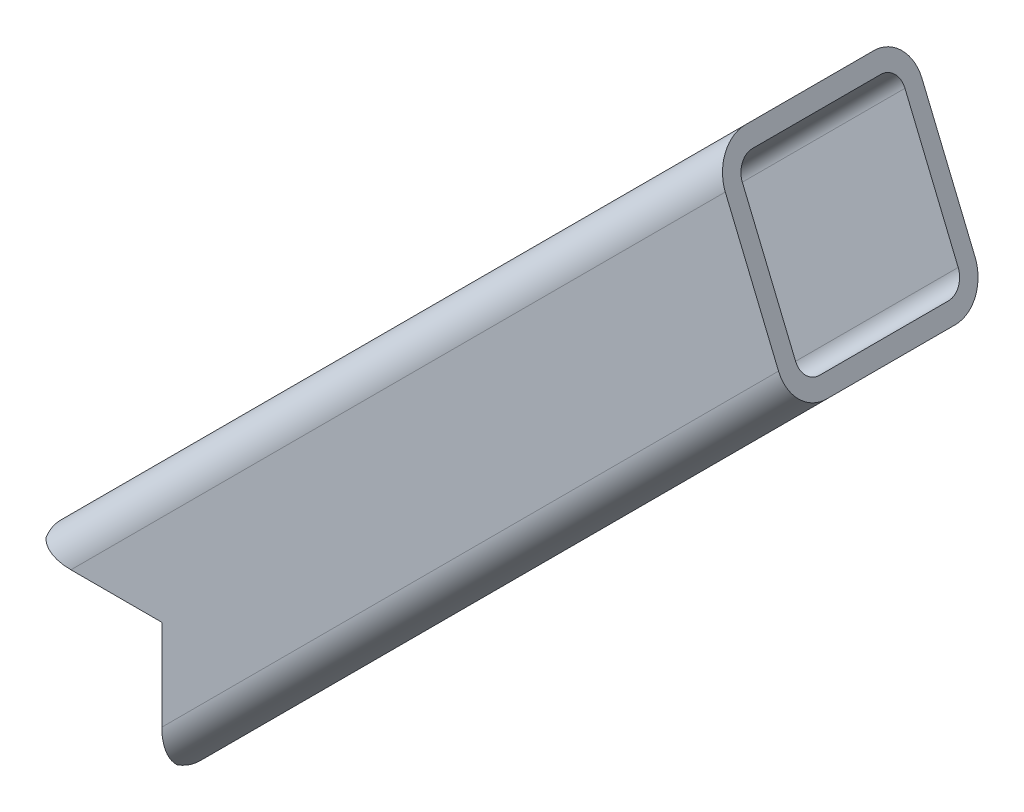
ISO-10303-21;
HEADER;
FILE_DESCRIPTION(('STEP AP214'),'2;1');
FILE_NAME('part.step','',(''),(''),'','','');
FILE_SCHEMA(('AUTOMOTIVE_DESIGN { 1 0 10303 214 1 1 1 1 }'));
ENDSEC;
DATA;
#1=APPLICATION_CONTEXT('core data for automotive mechanical design processes');
#2=APPLICATION_PROTOCOL_DEFINITION('international standard','automotive_design',2000,#1);
#3=PRODUCT_CONTEXT('',#1,'mechanical');
#4=PRODUCT('Part','Part','',(#3));
#5=PRODUCT_RELATED_PRODUCT_CATEGORY('part','',(#4));
#6=PRODUCT_DEFINITION_FORMATION('','',#4);
#7=PRODUCT_DEFINITION_CONTEXT('part definition',#1,'design');
#8=PRODUCT_DEFINITION('design','',#6,#7);
#9=PRODUCT_DEFINITION_SHAPE('','',#8);
#10=(LENGTH_UNIT() NAMED_UNIT(*) SI_UNIT(.MILLI.,.METRE.));
#11=(NAMED_UNIT(*) PLANE_ANGLE_UNIT() SI_UNIT($,.RADIAN.));
#12=(NAMED_UNIT(*) SI_UNIT($,.STERADIAN.) SOLID_ANGLE_UNIT());
#13=UNCERTAINTY_MEASURE_WITH_UNIT(LENGTH_MEASURE(1.E-05),#10,'distance_accuracy_value','');
#14=(GEOMETRIC_REPRESENTATION_CONTEXT(3) GLOBAL_UNCERTAINTY_ASSIGNED_CONTEXT((#13)) GLOBAL_UNIT_ASSIGNED_CONTEXT((#10,
#11,#12)) REPRESENTATION_CONTEXT('',''));
#15=CARTESIAN_POINT('',(0.,0.,0.));
#16=DIRECTION('',(0.,0.,1.));
#17=DIRECTION('',(1.,0.,0.));
#18=AXIS2_PLACEMENT_3D('',#15,#16,#17);
#19=CARTESIAN_POINT('',(-231.929646455628,206.929646455628,1415.2));
#20=DIRECTION('',(0.707106781186551,0.707106781186544,0.));
#21=DIRECTION('',(0.,0.,-1.));
#22=AXIS2_PLACEMENT_3D('',#19,#20,#21);
#23=PLANE('',#22);
#24=CARTESIAN_POINT('',(-218.070353544372,193.070353544372,1434.8));
#25=DIRECTION('',(0.707106781186551,0.707106781186544,0.));
#26=DIRECTION('',(0.,0.,-1.));
#27=AXIS2_PLACEMENT_3D('',#24,#25,#26);
#28=CIRCLE('',#27,5.19999999999995);
#29=CARTESIAN_POINT('',(-215.,190.,1437.66109388611));
#30=VERTEX_POINT('',#29);
#31=CARTESIAN_POINT('',(-214.393398282202,189.393398282202,1434.8));
#32=VERTEX_POINT('',#31);
#33=EDGE_CURVE('E140',#30,#32,#28,.T.);
#34=ORIENTED_EDGE('',*,*,#33,.F.);
#35=DIRECTION('',(0.,0.,1.));
#36=VECTOR('',#35,1.);
#37=CARTESIAN_POINT('',(-215.,190.,1300.));
#38=LINE('',#37,#36);
#39=CARTESIAN_POINT('',(-215.,190.,1412.33890611389));
#40=VERTEX_POINT('',#39);
#41=EDGE_CURVE('E136',#40,#30,#38,.T.);
#42=ORIENTED_EDGE('',*,*,#41,.F.);
#43=CARTESIAN_POINT('',(-218.070353544372,193.070353544372,1415.2));
#44=DIRECTION('',(0.707106781186551,0.707106781186544,0.));
#45=DIRECTION('',(0.,0.,-1.));
#46=AXIS2_PLACEMENT_3D('',#43,#44,#45);
#47=CIRCLE('',#46,5.19999999999995);
#48=CARTESIAN_POINT('',(-214.393398282202,189.393398282202,1415.2));
#49=VERTEX_POINT('',#48);
#50=EDGE_CURVE('E133',#49,#40,#47,.T.);
#51=ORIENTED_EDGE('',*,*,#50,.F.);
#52=DIRECTION('',(0.,0.,-1.));
#53=VECTOR('',#52,1.);
#54=CARTESIAN_POINT('',(-214.393398282202,189.393398282202,1434.8));
#55=LINE('',#54,#53);
#56=EDGE_CURVE('E127',#32,#49,#55,.T.);
#57=ORIENTED_EDGE('',*,*,#56,.F.);
#58=EDGE_LOOP('',(#34,#42,#51,#57));
#59=FACE_BOUND('',#58,.T.);
#60=ADVANCED_FACE('F39',(#59),#23,.F.);
#61=CARTESIAN_POINT('',(-124.999999999999,300.,1425.));
#62=DIRECTION('',(0.923879532511288,0.382683432365088,0.));
#63=DIRECTION('',(-0.382683432365088,0.923879532511288,0.));
#64=AXIS2_PLACEMENT_3D('',#61,#62,#63);
#65=PLANE('',#64);
#66=CARTESIAN_POINT('',(-129.059292911255,309.8,1434.8));
#67=DIRECTION('',(0.923879532511288,0.382683432365088,0.));
#68=DIRECTION('',(0.382683432365088,-0.923879532511288,0.));
#69=AXIS2_PLACEMENT_3D('',#66,#67,#68);
#70=ELLIPSE('',#69,2.81421972076021,2.59999999999999);
#71=CARTESIAN_POINT('',(-130.136248173425,312.4,1434.8));
#72=VERTEX_POINT('',#71);
#73=CARTESIAN_POINT('',(-129.059292911255,309.8,1437.4));
#74=VERTEX_POINT('',#73);
#75=EDGE_CURVE('E208',#72,#74,#70,.T.);
#76=ORIENTED_EDGE('',*,*,#75,.F.);
#77=DIRECTION('',(0.,0.,1.));
#78=VECTOR('',#77,1.);
#79=CARTESIAN_POINT('',(-130.136248173425,312.4,1415.2));
#80=LINE('',#79,#78);
#81=CARTESIAN_POINT('',(-130.136248173425,312.4,1415.2));
#82=VERTEX_POINT('',#81);
#83=EDGE_CURVE('E204',#82,#72,#80,.T.);
#84=ORIENTED_EDGE('',*,*,#83,.F.);
#85=CARTESIAN_POINT('',(-129.059292911255,309.8,1415.2));
#86=DIRECTION('',(0.923879532511288,0.382683432365088,0.));
#87=DIRECTION('',(0.382683432365088,-0.923879532511288,0.));
#88=AXIS2_PLACEMENT_3D('',#85,#86,#87);
#89=ELLIPSE('',#88,2.81421972076021,2.59999999999999);
#90=CARTESIAN_POINT('',(-129.059292911255,309.8,1412.6));
#91=VERTEX_POINT('',#90);
#92=EDGE_CURVE('E200',#91,#82,#89,.T.);
#93=ORIENTED_EDGE('',*,*,#92,.F.);
#94=DIRECTION('',(-0.382683432365088,0.923879532511288,0.));
#95=VECTOR('',#94,1.);
#96=CARTESIAN_POINT('',(-128.464823227813,308.364823227814,1412.6));
#97=LINE('',#96,#95);
#98=CARTESIAN_POINT('',(-120.940707088743,290.2,1412.6));
#99=VERTEX_POINT('',#98);
#100=EDGE_CURVE('E196',#99,#91,#97,.T.);
#101=ORIENTED_EDGE('',*,*,#100,.F.);
#102=CARTESIAN_POINT('',(-120.940707088743,290.2,1415.2));
#103=DIRECTION('',(0.923879532511288,0.382683432365088,0.));
#104=DIRECTION('',(0.382683432365088,-0.923879532511288,0.));
#105=AXIS2_PLACEMENT_3D('',#102,#103,#104);
#106=ELLIPSE('',#105,2.81421972076021,2.59999999999999);
#107=CARTESIAN_POINT('',(-119.863751826573,287.6,1415.2));
#108=VERTEX_POINT('',#107);
#109=EDGE_CURVE('E192',#108,#99,#106,.T.);
#110=ORIENTED_EDGE('',*,*,#109,.F.);
#111=DIRECTION('',(0.,0.,-1.));
#112=VECTOR('',#111,1.);
#113=CARTESIAN_POINT('',(-119.863751826573,287.6,1434.8));
#114=LINE('',#113,#112);
#115=CARTESIAN_POINT('',(-119.863751826573,287.6,1434.8));
#116=VERTEX_POINT('',#115);
#117=EDGE_CURVE('E187',#116,#108,#114,.T.);
#118=ORIENTED_EDGE('',*,*,#117,.F.);
#119=CARTESIAN_POINT('',(-120.940707088743,290.2,1434.8));
#120=DIRECTION('',(0.923879532511288,0.382683432365088,0.));
#121=DIRECTION('',(0.382683432365088,-0.923879532511288,0.));
#122=AXIS2_PLACEMENT_3D('',#119,#120,#121);
#123=ELLIPSE('',#122,2.81421972076021,2.59999999999999);
#124=CARTESIAN_POINT('',(-120.940707088743,290.2,1437.4));
#125=VERTEX_POINT('',#124);
#126=EDGE_CURVE('E182',#125,#116,#123,.T.);
#127=ORIENTED_EDGE('',*,*,#126,.F.);
#128=DIRECTION('',(0.382683432365088,-0.923879532511288,0.));
#129=VECTOR('',#128,1.);
#130=CARTESIAN_POINT('',(-121.535176772185,291.635176772186,1437.4));
#131=LINE('',#130,#129);
#132=EDGE_CURVE('E177',#74,#125,#131,.T.);
#133=ORIENTED_EDGE('',*,*,#132,.F.);
#134=EDGE_LOOP('',(#76,#84,#93,#101,#110,#118,#127,#133));
#135=FACE_BOUND('',#134,.T.);
#136=DIRECTION('',(-0.382683432365088,0.923879532511288,0.));
#137=VECTOR('',#136,1.);
#138=CARTESIAN_POINT('',(-128.464823227813,308.364823227814,1410.));
#139=LINE('',#138,#137);
#140=CARTESIAN_POINT('',(-120.940707088743,290.2,1410.));
#141=VERTEX_POINT('',#140);
#142=CARTESIAN_POINT('',(-129.059292911255,309.8,1410.));
#143=VERTEX_POINT('',#142);
#144=EDGE_CURVE('E289',#141,#143,#139,.T.);
#145=ORIENTED_EDGE('',*,*,#144,.T.);
#146=CARTESIAN_POINT('',(-129.059292911255,309.8,1415.2));
#147=DIRECTION('',(0.923879532511288,0.382683432365088,0.));
#148=DIRECTION('',(0.382683432365088,-0.923879532511288,0.));
#149=AXIS2_PLACEMENT_3D('',#146,#147,#148);
#150=ELLIPSE('',#149,5.62843944152039,5.19999999999995);
#151=CARTESIAN_POINT('',(-131.213203435595,315.,1415.2));
#152=VERTEX_POINT('',#151);
#153=EDGE_CURVE('E286',#143,#152,#150,.T.);
#154=ORIENTED_EDGE('',*,*,#153,.T.);
#155=DIRECTION('',(0.,0.,1.));
#156=VECTOR('',#155,1.);
#157=CARTESIAN_POINT('',(-131.213203435595,315.,1415.2));
#158=LINE('',#157,#156);
#159=CARTESIAN_POINT('',(-131.213203435595,315.,1434.8));
#160=VERTEX_POINT('',#159);
#161=EDGE_CURVE('E283',#152,#160,#158,.T.);
#162=ORIENTED_EDGE('',*,*,#161,.T.);
#163=CARTESIAN_POINT('',(-129.059292911255,309.8,1434.8));
#164=DIRECTION('',(0.923879532511288,0.382683432365088,0.));
#165=DIRECTION('',(0.382683432365088,-0.923879532511288,0.));
#166=AXIS2_PLACEMENT_3D('',#163,#164,#165);
#167=ELLIPSE('',#166,5.62843944152039,5.19999999999995);
#168=CARTESIAN_POINT('',(-129.059292911255,309.8,1440.));
#169=VERTEX_POINT('',#168);
#170=EDGE_CURVE('E280',#160,#169,#167,.T.);
#171=ORIENTED_EDGE('',*,*,#170,.T.);
#172=DIRECTION('',(0.382683432365088,-0.923879532511288,0.));
#173=VECTOR('',#172,1.);
#174=CARTESIAN_POINT('',(-121.535176772185,291.635176772186,1440.));
#175=LINE('',#174,#173);
#176=CARTESIAN_POINT('',(-120.940707088743,290.2,1440.));
#177=VERTEX_POINT('',#176);
#178=EDGE_CURVE('E277',#169,#177,#175,.T.);
#179=ORIENTED_EDGE('',*,*,#178,.T.);
#180=CARTESIAN_POINT('',(-120.940707088743,290.2,1434.8));
#181=DIRECTION('',(0.923879532511288,0.382683432365088,0.));
#182=DIRECTION('',(0.382683432365088,-0.923879532511288,0.));
#183=AXIS2_PLACEMENT_3D('',#180,#181,#182);
#184=ELLIPSE('',#183,5.62843944152039,5.19999999999995);
#185=CARTESIAN_POINT('',(-118.786796564403,285.,1434.8));
#186=VERTEX_POINT('',#185);
#187=EDGE_CURVE('E274',#177,#186,#184,.T.);
#188=ORIENTED_EDGE('',*,*,#187,.T.);
#189=DIRECTION('',(0.,0.,-1.));
#190=VECTOR('',#189,1.);
#191=CARTESIAN_POINT('',(-118.786796564403,285.,1434.8));
#192=LINE('',#191,#190);
#193=CARTESIAN_POINT('',(-118.786796564403,285.,1415.2));
#194=VERTEX_POINT('',#193);
#195=EDGE_CURVE('E272',#186,#194,#192,.T.);
#196=ORIENTED_EDGE('',*,*,#195,.T.);
#197=CARTESIAN_POINT('',(-120.940707088743,290.2,1415.2));
#198=DIRECTION('',(0.923879532511288,0.382683432365088,0.));
#199=DIRECTION('',(0.382683432365088,-0.923879532511288,0.));
#200=AXIS2_PLACEMENT_3D('',#197,#198,#199);
#201=ELLIPSE('',#200,5.62843944152039,5.19999999999995);
#202=EDGE_CURVE('E148',#194,#141,#201,.T.);
#203=ORIENTED_EDGE('',*,*,#202,.T.);
#204=EDGE_LOOP('',(#145,#154,#162,#171,#179,#188,#196,#203));
#205=FACE_BOUND('',#204,.T.);
#206=ADVANCED_FACE('F331',(#135,#205),#65,.T.);
#207=CARTESIAN_POINT('',(-118.070353544371,293.070353544372,1415.2));
#208=DIRECTION('',(-0.707106781186551,-0.707106781186544,0.));
#209=DIRECTION('',(0.707106781186544,-0.707106781186551,0.));
#210=AXIS2_PLACEMENT_3D('',#207,#208,#209);
#211=CYLINDRICAL_SURFACE('',#210,2.59999999999999);
#212=DIRECTION('',(-0.707106781186551,-0.707106781186544,0.));
#213=VECTOR('',#212,1.);
#214=CARTESIAN_POINT('',(-116.231875913286,291.231875913287,1415.2));
#215=LINE('',#214,#213);
#216=CARTESIAN_POINT('',(-215.,192.463751826574,1415.2));
#217=VERTEX_POINT('',#216);
#218=EDGE_CURVE('E183',#108,#217,#215,.T.);
#219=ORIENTED_EDGE('',*,*,#218,.F.);
#220=ORIENTED_EDGE('',*,*,#109,.T.);
#221=DIRECTION('',(-0.707106781186551,-0.707106781186544,0.));
#222=VECTOR('',#221,1.);
#223=CARTESIAN_POINT('',(-118.070353544371,293.070353544372,1412.6));
#224=LINE('',#223,#222);
#225=CARTESIAN_POINT('',(-215.,196.140707088744,1412.6));
#226=VERTEX_POINT('',#225);
#227=EDGE_CURVE('E188',#99,#226,#224,.T.);
#228=ORIENTED_EDGE('',*,*,#227,.T.);
#229=CARTESIAN_POINT('',(-215.,196.140707088744,1415.2));
#230=DIRECTION('',(-1.,0.,0.));
#231=DIRECTION('',(0.,-1.,0.));
#232=AXIS2_PLACEMENT_3D('',#229,#230,#231);
#233=ELLIPSE('',#232,3.67695526217002,2.59999999999999);
#234=EDGE_CURVE('E191',#226,#217,#233,.T.);
#235=ORIENTED_EDGE('',*,*,#234,.T.);
#236=EDGE_LOOP('',(#219,#220,#228,#235));
#237=FACE_BOUND('',#236,.T.);
#238=ADVANCED_FACE('F360',(#237),#211,.F.);
#239=CARTESIAN_POINT('',(-116.231875913286,291.231875913287,1434.8));
#240=DIRECTION('',(-0.707106781186544,0.707106781186551,0.));
#241=DIRECTION('',(-0.707106781186551,-0.707106781186544,0.));
#242=AXIS2_PLACEMENT_3D('',#239,#240,#241);
#243=PLANE('',#242);
#244=DIRECTION('',(-0.707106781186551,-0.707106781186544,0.));
#245=VECTOR('',#244,1.);
#246=CARTESIAN_POINT('',(-116.231875913286,291.231875913287,1434.8));
#247=LINE('',#246,#245);
#248=CARTESIAN_POINT('',(-215.,192.463751826574,1434.8));
#249=VERTEX_POINT('',#248);
#250=EDGE_CURVE('E178',#116,#249,#247,.T.);
#251=ORIENTED_EDGE('',*,*,#250,.F.);
#252=ORIENTED_EDGE('',*,*,#117,.T.);
#253=ORIENTED_EDGE('',*,*,#218,.T.);
#254=DIRECTION('',(0.,0.,1.));
#255=VECTOR('',#254,1.);
#256=CARTESIAN_POINT('',(-215.,192.463751826574,1434.8));
#257=LINE('',#256,#255);
#258=EDGE_CURVE('E186',#217,#249,#257,.T.);
#259=ORIENTED_EDGE('',*,*,#258,.T.);
#260=EDGE_LOOP('',(#251,#252,#253,#259));
#261=FACE_BOUND('',#260,.T.);
#262=ADVANCED_FACE('F373',(#261),#243,.T.);
#263=CARTESIAN_POINT('',(-118.070353544371,293.070353544372,1434.8));
#264=DIRECTION('',(-0.707106781186551,-0.707106781186544,0.));
#265=DIRECTION('',(0.707106781186544,-0.707106781186551,0.));
#266=AXIS2_PLACEMENT_3D('',#263,#264,#265);
#267=CYLINDRICAL_SURFACE('',#266,2.59999999999999);
#268=DIRECTION('',(-0.707106781186551,-0.707106781186544,0.));
#269=VECTOR('',#268,1.);
#270=CARTESIAN_POINT('',(-118.070353544371,293.070353544372,1437.4));
#271=LINE('',#270,#269);
#272=CARTESIAN_POINT('',(-215.,196.140707088744,1437.4));
#273=VERTEX_POINT('',#272);
#274=EDGE_CURVE('E173',#125,#273,#271,.T.);
#275=ORIENTED_EDGE('',*,*,#274,.F.);
#276=ORIENTED_EDGE('',*,*,#126,.T.);
#277=ORIENTED_EDGE('',*,*,#250,.T.);
#278=CARTESIAN_POINT('',(-215.,196.140707088744,1434.8));
#279=DIRECTION('',(-1.,0.,0.));
#280=DIRECTION('',(0.,-1.,0.));
#281=AXIS2_PLACEMENT_3D('',#278,#279,#280);
#282=ELLIPSE('',#281,3.67695526217002,2.59999999999999);
#283=EDGE_CURVE('E181',#249,#273,#282,.T.);
#284=ORIENTED_EDGE('',*,*,#283,.T.);
#285=EDGE_LOOP('',(#275,#276,#277,#284));
#286=FACE_BOUND('',#285,.T.);
#287=ADVANCED_FACE('F376',(#286),#267,.F.);
#288=CARTESIAN_POINT('',(-118.070353544371,293.070353544372,1440.));
#289=DIRECTION('',(0.,0.,-1.));
#290=DIRECTION('',(-1.,0.,0.));
#291=AXIS2_PLACEMENT_3D('',#288,#289,#290);
#292=PLANE('',#291);
#293=ORIENTED_EDGE('',*,*,#178,.F.);
#294=DIRECTION('',(-0.707106781186551,-0.707106781186544,0.));
#295=VECTOR('',#294,1.);
#296=CARTESIAN_POINT('',(-131.929646455627,306.929646455628,1440.));
#297=LINE('',#296,#295);
#298=CARTESIAN_POINT('',(-228.859292911256,210.,1440.));
#299=VERTEX_POINT('',#298);
#300=EDGE_CURVE('E209',#169,#299,#297,.T.);
#301=ORIENTED_EDGE('',*,*,#300,.T.);
#302=DIRECTION('',(-1.,0.,0.));
#303=VECTOR('',#302,1.);
#304=CARTESIAN_POINT('',(-118.070353544371,210.,1440.));
#305=LINE('',#304,#303);
#306=CARTESIAN_POINT('',(-215.,210.,1440.));
#307=VERTEX_POINT('',#306);
#308=EDGE_CURVE('E238',#307,#299,#305,.T.);
#309=ORIENTED_EDGE('',*,*,#308,.F.);
#310=DIRECTION('',(0.,1.,0.));
#311=VECTOR('',#310,1.);
#312=CARTESIAN_POINT('',(-215.,293.070353544372,1440.));
#313=LINE('',#312,#311);
#314=CARTESIAN_POINT('',(-215.,196.140707088744,1440.));
#315=VERTEX_POINT('',#314);
#316=EDGE_CURVE('E236',#315,#307,#313,.T.);
#317=ORIENTED_EDGE('',*,*,#316,.F.);
#318=DIRECTION('',(-0.707106781186551,-0.707106781186544,0.));
#319=VECTOR('',#318,1.);
#320=CARTESIAN_POINT('',(-118.070353544371,293.070353544372,1440.));
#321=LINE('',#320,#319);
#322=EDGE_CURVE('E214',#177,#315,#321,.T.);
#323=ORIENTED_EDGE('',*,*,#322,.F.);
#324=EDGE_LOOP('',(#293,#301,#309,#317,#323));
#325=FACE_BOUND('',#324,.T.);
#326=ADVANCED_FACE('F381',(#325),#292,.F.);
#327=CARTESIAN_POINT('',(-118.070353544371,293.070353544372,1437.4));
#328=DIRECTION('',(0.,0.,-1.));
#329=DIRECTION('',(-1.,0.,0.));
#330=AXIS2_PLACEMENT_3D('',#327,#328,#329);
#331=PLANE('',#330);
#332=DIRECTION('',(-0.707106781186551,-0.707106781186544,0.));
#333=VECTOR('',#332,1.);
#334=CARTESIAN_POINT('',(-131.929646455627,306.929646455628,1437.4));
#335=LINE('',#334,#333);
#336=CARTESIAN_POINT('',(-228.859292911256,210.,1437.4));
#337=VERTEX_POINT('',#336);
#338=EDGE_CURVE('E205',#74,#337,#335,.T.);
#339=ORIENTED_EDGE('',*,*,#338,.F.);
#340=ORIENTED_EDGE('',*,*,#132,.T.);
#341=ORIENTED_EDGE('',*,*,#274,.T.);
#342=DIRECTION('',(0.,1.,0.));
#343=VECTOR('',#342,1.);
#344=CARTESIAN_POINT('',(-215.,293.070353544372,1437.4));
#345=LINE('',#344,#343);
#346=CARTESIAN_POINT('',(-215.,210.,1437.4));
#347=VERTEX_POINT('',#346);
#348=EDGE_CURVE('E176',#273,#347,#345,.T.);
#349=ORIENTED_EDGE('',*,*,#348,.T.);
#350=DIRECTION('',(-1.,0.,0.));
#351=VECTOR('',#350,1.);
#352=CARTESIAN_POINT('',(-118.070353544371,210.,1437.4));
#353=LINE('',#352,#351);
#354=EDGE_CURVE('E250',#347,#337,#353,.T.);
#355=ORIENTED_EDGE('',*,*,#354,.T.);
#356=EDGE_LOOP('',(#339,#340,#341,#349,#355));
#357=FACE_BOUND('',#356,.T.);
#358=ADVANCED_FACE('F318',(#357),#331,.T.);
#359=CARTESIAN_POINT('',(-131.929646455627,306.929646455628,1434.8));
#360=DIRECTION('',(-0.707106781186551,-0.707106781186544,0.));
#361=DIRECTION('',(0.707106781186544,-0.707106781186551,0.));
#362=AXIS2_PLACEMENT_3D('',#359,#360,#361);
#363=CYLINDRICAL_SURFACE('',#362,2.59999999999999);
#364=DIRECTION('',(-0.707106781186551,-0.707106781186544,0.));
#365=VECTOR('',#364,1.);
#366=CARTESIAN_POINT('',(-133.768124086712,308.768124086713,1434.8));
#367=LINE('',#366,#365);
#368=CARTESIAN_POINT('',(-232.536248173426,210.,1434.8));
#369=VERTEX_POINT('',#368);
#370=EDGE_CURVE('E201',#72,#369,#367,.T.);
#371=ORIENTED_EDGE('',*,*,#370,.F.);
#372=ORIENTED_EDGE('',*,*,#75,.T.);
#373=ORIENTED_EDGE('',*,*,#338,.T.);
#374=CARTESIAN_POINT('',(-228.859292911256,210.,1434.8));
#375=DIRECTION('',(0.,-1.,0.));
#376=DIRECTION('',(-1.,0.,0.));
#377=AXIS2_PLACEMENT_3D('',#374,#375,#376);
#378=ELLIPSE('',#377,3.67695526217005,2.59999999999999);
#379=EDGE_CURVE('E207',#337,#369,#378,.T.);
#380=ORIENTED_EDGE('',*,*,#379,.T.);
#381=EDGE_LOOP('',(#371,#372,#373,#380));
#382=FACE_BOUND('',#381,.T.);
#383=ADVANCED_FACE('F310',(#382),#363,.F.);
#384=CARTESIAN_POINT('',(-133.768124086712,308.768124086713,1415.2));
#385=DIRECTION('',(0.707106781186544,-0.707106781186551,0.));
#386=DIRECTION('',(0.707106781186551,0.707106781186544,0.));
#387=AXIS2_PLACEMENT_3D('',#384,#385,#386);
#388=PLANE('',#387);
#389=DIRECTION('',(-0.707106781186551,-0.707106781186544,0.));
#390=VECTOR('',#389,1.);
#391=CARTESIAN_POINT('',(-133.768124086712,308.768124086713,1415.2));
#392=LINE('',#391,#390);
#393=CARTESIAN_POINT('',(-232.536248173426,210.,1415.2));
#394=VERTEX_POINT('',#393);
#395=EDGE_CURVE('E197',#82,#394,#392,.T.);
#396=ORIENTED_EDGE('',*,*,#395,.F.);
#397=ORIENTED_EDGE('',*,*,#83,.T.);
#398=ORIENTED_EDGE('',*,*,#370,.T.);
#399=DIRECTION('',(0.,0.,-1.));
#400=VECTOR('',#399,1.);
#401=CARTESIAN_POINT('',(-232.536248173426,210.,1415.2));
#402=LINE('',#401,#400);
#403=EDGE_CURVE('E203',#369,#394,#402,.T.);
#404=ORIENTED_EDGE('',*,*,#403,.T.);
#405=EDGE_LOOP('',(#396,#397,#398,#404));
#406=FACE_BOUND('',#405,.T.);
#407=ADVANCED_FACE('F329',(#406),#388,.T.);
#408=CARTESIAN_POINT('',(-131.929646455627,306.929646455628,1415.2));
#409=DIRECTION('',(-0.707106781186551,-0.707106781186544,0.));
#410=DIRECTION('',(0.707106781186544,-0.707106781186551,0.));
#411=AXIS2_PLACEMENT_3D('',#408,#409,#410);
#412=CYLINDRICAL_SURFACE('',#411,2.59999999999999);
#413=DIRECTION('',(-0.707106781186551,-0.707106781186544,0.));
#414=VECTOR('',#413,1.);
#415=CARTESIAN_POINT('',(-131.929646455627,306.929646455628,1412.6));
#416=LINE('',#415,#414);
#417=CARTESIAN_POINT('',(-228.859292911256,210.,1412.6));
#418=VERTEX_POINT('',#417);
#419=EDGE_CURVE('E193',#91,#418,#416,.T.);
#420=ORIENTED_EDGE('',*,*,#419,.F.);
#421=ORIENTED_EDGE('',*,*,#92,.T.);
#422=ORIENTED_EDGE('',*,*,#395,.T.);
#423=CARTESIAN_POINT('',(-228.859292911256,210.,1415.2));
#424=DIRECTION('',(0.,-1.,0.));
#425=DIRECTION('',(-1.,0.,0.));
#426=AXIS2_PLACEMENT_3D('',#423,#424,#425);
#427=ELLIPSE('',#426,3.67695526217005,2.59999999999999);
#428=EDGE_CURVE('E199',#394,#418,#427,.T.);
#429=ORIENTED_EDGE('',*,*,#428,.T.);
#430=EDGE_LOOP('',(#420,#421,#422,#429));
#431=FACE_BOUND('',#430,.T.);
#432=ADVANCED_FACE('F370',(#431),#412,.F.);
#433=CARTESIAN_POINT('',(-131.929646455627,306.929646455628,1412.6));
#434=DIRECTION('',(0.,0.,1.));
#435=DIRECTION('',(1.,0.,0.));
#436=AXIS2_PLACEMENT_3D('',#433,#434,#435);
#437=PLANE('',#436);
#438=ORIENTED_EDGE('',*,*,#227,.F.);
#439=ORIENTED_EDGE('',*,*,#100,.T.);
#440=ORIENTED_EDGE('',*,*,#419,.T.);
#441=DIRECTION('',(1.,0.,0.));
#442=VECTOR('',#441,1.);
#443=CARTESIAN_POINT('',(-131.929646455627,210.,1412.6));
#444=LINE('',#443,#442);
#445=CARTESIAN_POINT('',(-215.,210.,1412.6));
#446=VERTEX_POINT('',#445);
#447=EDGE_CURVE('E195',#418,#446,#444,.T.);
#448=ORIENTED_EDGE('',*,*,#447,.T.);
#449=DIRECTION('',(0.,-1.,0.));
#450=VECTOR('',#449,1.);
#451=CARTESIAN_POINT('',(-215.,306.929646455628,1412.6));
#452=LINE('',#451,#450);
#453=EDGE_CURVE('E172',#446,#226,#452,.T.);
#454=ORIENTED_EDGE('',*,*,#453,.T.);
#455=EDGE_LOOP('',(#438,#439,#440,#448,#454));
#456=FACE_BOUND('',#455,.T.);
#457=ADVANCED_FACE('F368',(#456),#437,.T.);
#458=CARTESIAN_POINT('',(-131.929646455627,306.929646455628,1410.));
#459=DIRECTION('',(0.,0.,1.));
#460=DIRECTION('',(1.,0.,0.));
#461=AXIS2_PLACEMENT_3D('',#458,#459,#460);
#462=PLANE('',#461);
#463=ORIENTED_EDGE('',*,*,#144,.F.);
#464=DIRECTION('',(-0.707106781186551,-0.707106781186544,0.));
#465=VECTOR('',#464,1.);
#466=CARTESIAN_POINT('',(-118.070353544371,293.070353544372,1410.));
#467=LINE('',#466,#465);
#468=CARTESIAN_POINT('',(-215.,196.140707088744,1410.));
#469=VERTEX_POINT('',#468);
#470=EDGE_CURVE('E168',#141,#469,#467,.T.);
#471=ORIENTED_EDGE('',*,*,#470,.T.);
#472=DIRECTION('',(0.,-1.,0.));
#473=VECTOR('',#472,1.);
#474=CARTESIAN_POINT('',(-215.,306.929646455628,1410.));
#475=LINE('',#474,#473);
#476=CARTESIAN_POINT('',(-215.,210.,1410.));
#477=VERTEX_POINT('',#476);
#478=EDGE_CURVE('E233',#477,#469,#475,.T.);
#479=ORIENTED_EDGE('',*,*,#478,.F.);
#480=DIRECTION('',(1.,0.,0.));
#481=VECTOR('',#480,1.);
#482=CARTESIAN_POINT('',(-131.929646455627,210.,1410.));
#483=LINE('',#482,#481);
#484=CARTESIAN_POINT('',(-228.859292911256,210.,1410.));
#485=VERTEX_POINT('',#484);
#486=EDGE_CURVE('E228',#485,#477,#483,.T.);
#487=ORIENTED_EDGE('',*,*,#486,.F.);
#488=DIRECTION('',(-0.707106781186551,-0.707106781186544,0.));
#489=VECTOR('',#488,1.);
#490=CARTESIAN_POINT('',(-131.929646455627,306.929646455628,1410.));
#491=LINE('',#490,#489);
#492=EDGE_CURVE('E43',#143,#485,#491,.T.);
#493=ORIENTED_EDGE('',*,*,#492,.F.);
#494=EDGE_LOOP('',(#463,#471,#479,#487,#493));
#495=FACE_BOUND('',#494,.T.);
#496=ADVANCED_FACE('F397',(#495),#462,.F.);
#497=CARTESIAN_POINT('',(-231.,210.,1300.));
#498=DIRECTION('',(0.,-1.,0.));
#499=DIRECTION('',(0.,0.,-1.));
#500=AXIS2_PLACEMENT_3D('',#497,#498,#499);
#501=PLANE('',#500);
#502=CARTESIAN_POINT('',(-228.859292911256,210.,1434.8));
#503=DIRECTION('',(0.,-1.,0.));
#504=DIRECTION('',(-1.,0.,0.));
#505=AXIS2_PLACEMENT_3D('',#502,#503,#504);
#506=ELLIPSE('',#505,7.35391052434007,5.19999999999995);
#507=CARTESIAN_POINT('',(-235.,210.,1437.66109388611));
#508=VERTEX_POINT('',#507);
#509=EDGE_CURVE('E171',#299,#508,#506,.T.);
#510=ORIENTED_EDGE('',*,*,#509,.T.);
#511=DIRECTION('',(0.,0.,1.));
#512=VECTOR('',#511,1.);
#513=CARTESIAN_POINT('',(-235.,210.,1300.));
#514=LINE('',#513,#512);
#515=CARTESIAN_POINT('',(-235.,210.,1412.33890611389));
#516=VERTEX_POINT('',#515);
#517=EDGE_CURVE('E11',#516,#508,#514,.T.);
#518=ORIENTED_EDGE('',*,*,#517,.F.);
#519=CARTESIAN_POINT('',(-228.859292911256,210.,1415.2));
#520=DIRECTION('',(0.,-1.,0.));
#521=DIRECTION('',(-1.,0.,0.));
#522=AXIS2_PLACEMENT_3D('',#519,#520,#521);
#523=ELLIPSE('',#522,7.35391052434007,5.19999999999995);
#524=EDGE_CURVE('E232',#516,#485,#523,.T.);
#525=ORIENTED_EDGE('',*,*,#524,.T.);
#526=ORIENTED_EDGE('',*,*,#486,.T.);
#527=DIRECTION('',(0.,0.,1.));
#528=VECTOR('',#527,1.);
#529=CARTESIAN_POINT('',(-215.,210.,1300.));
#530=LINE('',#529,#528);
#531=EDGE_CURVE('E231',#477,#446,#530,.T.);
#532=ORIENTED_EDGE('',*,*,#531,.T.);
#533=ORIENTED_EDGE('',*,*,#447,.F.);
#534=ORIENTED_EDGE('',*,*,#428,.F.);
#535=ORIENTED_EDGE('',*,*,#403,.F.);
#536=ORIENTED_EDGE('',*,*,#379,.F.);
#537=ORIENTED_EDGE('',*,*,#354,.F.);
#538=EDGE_CURVE('E241',#347,#307,#530,.T.);
#539=ORIENTED_EDGE('',*,*,#538,.T.);
#540=ORIENTED_EDGE('',*,*,#308,.T.);
#541=EDGE_LOOP('',(#510,#518,#525,#526,#532,#533,#534,#535,#536,#537,#539,#540));
#542=FACE_BOUND('',#541,.T.);
#543=ADVANCED_FACE('F322',(#542),#501,.T.);
#544=CARTESIAN_POINT('',(-215.,194.,1300.));
#545=DIRECTION('',(-1.,0.,0.));
#546=DIRECTION('',(0.,0.,1.));
#547=AXIS2_PLACEMENT_3D('',#544,#545,#546);
#548=PLANE('',#547);
#549=ORIENTED_EDGE('',*,*,#316,.T.);
#550=ORIENTED_EDGE('',*,*,#538,.F.);
#551=ORIENTED_EDGE('',*,*,#348,.F.);
#552=ORIENTED_EDGE('',*,*,#283,.F.);
#553=ORIENTED_EDGE('',*,*,#258,.F.);
#554=ORIENTED_EDGE('',*,*,#234,.F.);
#555=ORIENTED_EDGE('',*,*,#453,.F.);
#556=ORIENTED_EDGE('',*,*,#531,.F.);
#557=ORIENTED_EDGE('',*,*,#478,.T.);
#558=CARTESIAN_POINT('',(-215.,196.140707088744,1415.2));
#559=DIRECTION('',(-1.,0.,0.));
#560=DIRECTION('',(0.,-1.,0.));
#561=AXIS2_PLACEMENT_3D('',#558,#559,#560);
#562=ELLIPSE('',#561,7.35391052433999,5.19999999999995);
#563=EDGE_CURVE('E167',#469,#40,#562,.T.);
#564=ORIENTED_EDGE('',*,*,#563,.T.);
#565=ORIENTED_EDGE('',*,*,#41,.T.);
#566=CARTESIAN_POINT('',(-215.,196.140707088744,1434.8));
#567=DIRECTION('',(-1.,0.,0.));
#568=DIRECTION('',(0.,-1.,0.));
#569=AXIS2_PLACEMENT_3D('',#566,#567,#568);
#570=ELLIPSE('',#569,7.35391052433999,5.19999999999995);
#571=EDGE_CURVE('E157',#30,#315,#570,.T.);
#572=ORIENTED_EDGE('',*,*,#571,.T.);
#573=EDGE_LOOP('',(#549,#550,#551,#552,#553,#554,#555,#556,#557,#564,#565,#572));
#574=FACE_BOUND('',#573,.T.);
#575=ADVANCED_FACE('F364',(#574),#548,.T.);
#576=CARTESIAN_POINT('',(-114.393398282201,289.393398282202,1434.8));
#577=DIRECTION('',(-0.707106781186544,0.707106781186551,0.));
#578=DIRECTION('',(-0.707106781186551,-0.707106781186544,0.));
#579=AXIS2_PLACEMENT_3D('',#576,#577,#578);
#580=PLANE('',#579);
#581=DIRECTION('',(-0.707106781186551,-0.707106781186544,0.));
#582=VECTOR('',#581,1.);
#583=CARTESIAN_POINT('',(-114.393398282201,289.393398282202,1434.8));
#584=LINE('',#583,#582);
#585=EDGE_CURVE('E154',#186,#32,#584,.T.);
#586=ORIENTED_EDGE('',*,*,#585,.T.);
#587=ORIENTED_EDGE('',*,*,#56,.T.);
#588=DIRECTION('',(-0.707106781186551,-0.707106781186544,0.));
#589=VECTOR('',#588,1.);
#590=CARTESIAN_POINT('',(-114.393398282201,289.393398282202,1415.2));
#591=LINE('',#590,#589);
#592=EDGE_CURVE('E141',#194,#49,#591,.T.);
#593=ORIENTED_EDGE('',*,*,#592,.F.);
#594=ORIENTED_EDGE('',*,*,#195,.F.);
#595=EDGE_LOOP('',(#586,#587,#593,#594));
#596=FACE_BOUND('',#595,.T.);
#597=ADVANCED_FACE('F153',(#596),#580,.F.);
#598=CARTESIAN_POINT('',(-118.070353544371,293.070353544372,1415.2));
#599=DIRECTION('',(-0.707106781186551,-0.707106781186544,0.));
#600=DIRECTION('',(0.707106781186544,-0.707106781186551,0.));
#601=AXIS2_PLACEMENT_3D('',#598,#599,#600);
#602=CYLINDRICAL_SURFACE('',#601,5.19999999999995);
#603=ORIENTED_EDGE('',*,*,#592,.T.);
#604=ORIENTED_EDGE('',*,*,#50,.T.);
#605=ORIENTED_EDGE('',*,*,#563,.F.);
#606=ORIENTED_EDGE('',*,*,#470,.F.);
#607=ORIENTED_EDGE('',*,*,#202,.F.);
#608=EDGE_LOOP('',(#603,#604,#605,#606,#607));
#609=FACE_BOUND('',#608,.T.);
#610=ADVANCED_FACE('F145',(#609),#602,.T.);
#611=CARTESIAN_POINT('',(-118.070353544371,293.070353544372,1434.8));
#612=DIRECTION('',(-0.707106781186551,-0.707106781186544,0.));
#613=DIRECTION('',(0.707106781186544,-0.707106781186551,0.));
#614=AXIS2_PLACEMENT_3D('',#611,#612,#613);
#615=CYLINDRICAL_SURFACE('',#614,5.19999999999995);
#616=ORIENTED_EDGE('',*,*,#571,.F.);
#617=ORIENTED_EDGE('',*,*,#33,.T.);
#618=ORIENTED_EDGE('',*,*,#585,.F.);
#619=ORIENTED_EDGE('',*,*,#187,.F.);
#620=ORIENTED_EDGE('',*,*,#322,.T.);
#621=EDGE_LOOP('',(#616,#617,#618,#619,#620));
#622=FACE_BOUND('',#621,.T.);
#623=ADVANCED_FACE('F399',(#622),#615,.T.);
#624=CARTESIAN_POINT('',(-135.606601717797,310.606601717798,1415.2));
#625=DIRECTION('',(0.707106781186544,-0.707106781186551,0.));
#626=DIRECTION('',(0.707106781186551,0.707106781186544,0.));
#627=AXIS2_PLACEMENT_3D('',#624,#625,#626);
#628=PLANE('',#627);
#629=DIRECTION('',(-0.707106781186551,-0.707106781186544,0.));
#630=VECTOR('',#629,1.);
#631=CARTESIAN_POINT('',(-135.606601717797,310.606601717798,1415.2));
#632=LINE('',#631,#630);
#633=CARTESIAN_POINT('',(-235.606601717798,210.606601717798,1415.2));
#634=VERTEX_POINT('',#633);
#635=EDGE_CURVE('E211',#152,#634,#632,.T.);
#636=ORIENTED_EDGE('',*,*,#635,.T.);
#637=DIRECTION('',(0.,0.,1.));
#638=VECTOR('',#637,1.);
#639=CARTESIAN_POINT('',(-235.606601717798,210.606601717798,1415.2));
#640=LINE('',#639,#638);
#641=CARTESIAN_POINT('',(-235.606601717798,210.606601717798,1434.8));
#642=VERTEX_POINT('',#641);
#643=EDGE_CURVE('E213',#634,#642,#640,.T.);
#644=ORIENTED_EDGE('',*,*,#643,.T.);
#645=DIRECTION('',(-0.707106781186551,-0.707106781186544,0.));
#646=VECTOR('',#645,1.);
#647=CARTESIAN_POINT('',(-135.606601717797,310.606601717798,1434.8));
#648=LINE('',#647,#646);
#649=EDGE_CURVE('E217',#160,#642,#648,.T.);
#650=ORIENTED_EDGE('',*,*,#649,.F.);
#651=ORIENTED_EDGE('',*,*,#161,.F.);
#652=EDGE_LOOP('',(#636,#644,#650,#651));
#653=FACE_BOUND('',#652,.T.);
#654=ADVANCED_FACE('F395',(#653),#628,.F.);
#655=CARTESIAN_POINT('',(-131.929646455627,306.929646455628,1434.8));
#656=DIRECTION('',(-0.707106781186551,-0.707106781186544,0.));
#657=DIRECTION('',(0.707106781186544,-0.707106781186551,0.));
#658=AXIS2_PLACEMENT_3D('',#655,#656,#657);
#659=CYLINDRICAL_SURFACE('',#658,5.19999999999995);
#660=ORIENTED_EDGE('',*,*,#649,.T.);
#661=CARTESIAN_POINT('',(-231.929646455628,206.929646455628,1434.8));
#662=DIRECTION('',(0.707106781186551,0.707106781186544,0.));
#663=DIRECTION('',(0.,0.,-1.));
#664=AXIS2_PLACEMENT_3D('',#661,#662,#663);
#665=CIRCLE('',#664,5.19999999999995);
#666=EDGE_CURVE('E165',#642,#508,#665,.T.);
#667=ORIENTED_EDGE('',*,*,#666,.T.);
#668=ORIENTED_EDGE('',*,*,#509,.F.);
#669=ORIENTED_EDGE('',*,*,#300,.F.);
#670=ORIENTED_EDGE('',*,*,#170,.F.);
#671=EDGE_LOOP('',(#660,#667,#668,#669,#670));
#672=FACE_BOUND('',#671,.T.);
#673=ADVANCED_FACE('F393',(#672),#659,.T.);
#674=CARTESIAN_POINT('',(-131.929646455627,306.929646455628,1415.2));
#675=DIRECTION('',(-0.707106781186551,-0.707106781186544,0.));
#676=DIRECTION('',(0.707106781186544,-0.707106781186551,0.));
#677=AXIS2_PLACEMENT_3D('',#674,#675,#676);
#678=CYLINDRICAL_SURFACE('',#677,5.19999999999995);
#679=ORIENTED_EDGE('',*,*,#524,.F.);
#680=CARTESIAN_POINT('',(-231.929646455628,206.929646455628,1415.2));
#681=DIRECTION('',(0.707106781186551,0.707106781186544,0.));
#682=DIRECTION('',(0.,0.,-1.));
#683=AXIS2_PLACEMENT_3D('',#680,#681,#682);
#684=CIRCLE('',#683,5.19999999999995);
#685=EDGE_CURVE('E162',#516,#634,#684,.T.);
#686=ORIENTED_EDGE('',*,*,#685,.T.);
#687=ORIENTED_EDGE('',*,*,#635,.F.);
#688=ORIENTED_EDGE('',*,*,#153,.F.);
#689=ORIENTED_EDGE('',*,*,#492,.T.);
#690=EDGE_LOOP('',(#679,#686,#687,#688,#689));
#691=FACE_BOUND('',#690,.T.);
#692=ADVANCED_FACE('F389',(#691),#678,.T.);
#693=ORIENTED_EDGE('',*,*,#685,.F.);
#694=ORIENTED_EDGE('',*,*,#517,.T.);
#695=ORIENTED_EDGE('',*,*,#666,.F.);
#696=ORIENTED_EDGE('',*,*,#643,.F.);
#697=EDGE_LOOP('',(#693,#694,#695,#696));
#698=FACE_BOUND('',#697,.T.);
#699=ADVANCED_FACE('F41',(#698),#23,.F.);
#700=CLOSED_SHELL('',(#60,#206,#238,#262,#287,#326,#358,#383,#407,#432,#457,#496,#543,#575,#597,
#610,#623,#654,#673,#692,#699));
#701=MANIFOLD_SOLID_BREP('B2',#700);
#702=ADVANCED_BREP_SHAPE_REPRESENTATION('',(#18,#701),#14);
#703=SHAPE_DEFINITION_REPRESENTATION(#9,#702);
ENDSEC;
END-ISO-10303-21;
